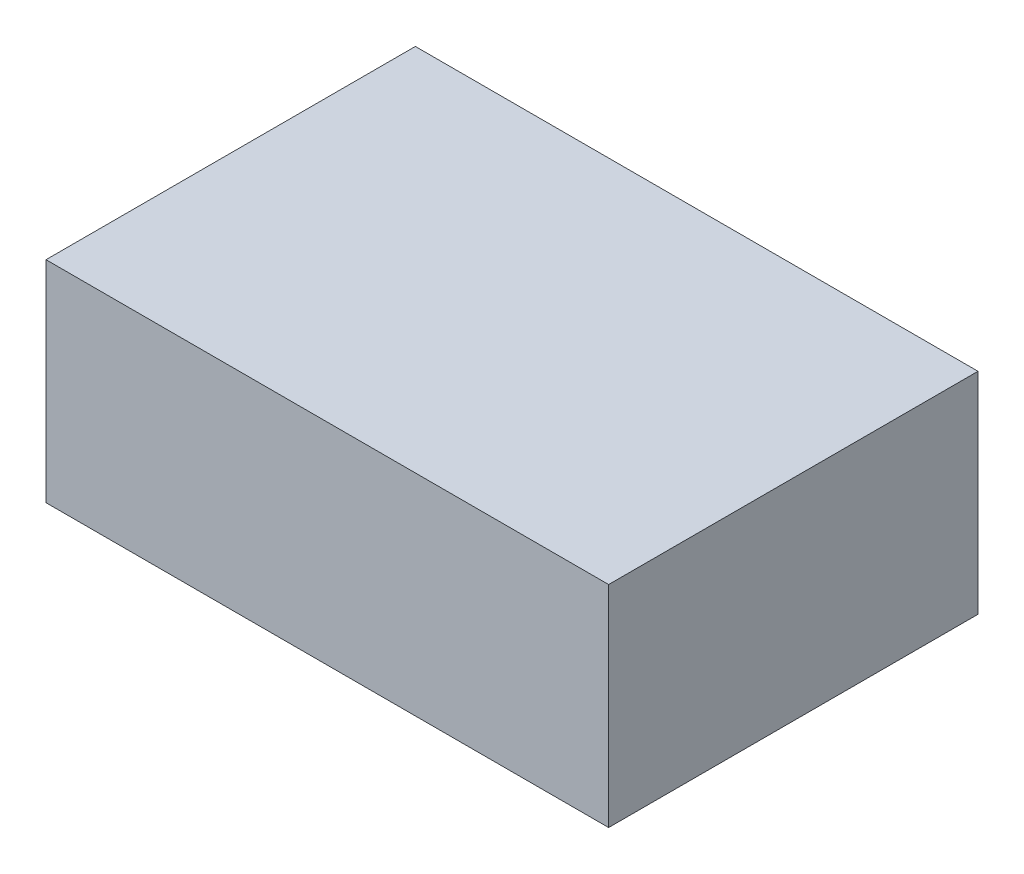
ISO-10303-21;
HEADER;
FILE_DESCRIPTION(('STEP AP214'),'2;1');
FILE_NAME('part.step','',(''),(''),'','','');
FILE_SCHEMA(('AUTOMOTIVE_DESIGN { 1 0 10303 214 1 1 1 1 }'));
ENDSEC;
DATA;
#1=APPLICATION_CONTEXT('core data for automotive mechanical design processes');
#2=APPLICATION_PROTOCOL_DEFINITION('international standard','automotive_design',2000,#1);
#3=PRODUCT_CONTEXT('',#1,'mechanical');
#4=PRODUCT('Part','Part','',(#3));
#5=PRODUCT_RELATED_PRODUCT_CATEGORY('part','',(#4));
#6=PRODUCT_DEFINITION_FORMATION('','',#4);
#7=PRODUCT_DEFINITION_CONTEXT('part definition',#1,'design');
#8=PRODUCT_DEFINITION('design','',#6,#7);
#9=PRODUCT_DEFINITION_SHAPE('','',#8);
#10=(LENGTH_UNIT() NAMED_UNIT(*) SI_UNIT(.MILLI.,.METRE.));
#11=(NAMED_UNIT(*) PLANE_ANGLE_UNIT() SI_UNIT($,.RADIAN.));
#12=(NAMED_UNIT(*) SI_UNIT($,.STERADIAN.) SOLID_ANGLE_UNIT());
#13=UNCERTAINTY_MEASURE_WITH_UNIT(LENGTH_MEASURE(1.E-05),#10,'distance_accuracy_value','');
#14=(GEOMETRIC_REPRESENTATION_CONTEXT(3) GLOBAL_UNCERTAINTY_ASSIGNED_CONTEXT((#13)) GLOBAL_UNIT_ASSIGNED_CONTEXT((#10,
#11,#12)) REPRESENTATION_CONTEXT('',''));
#15=CARTESIAN_POINT('',(0.,0.,0.));
#16=DIRECTION('',(0.,0.,1.));
#17=DIRECTION('',(1.,0.,0.));
#18=AXIS2_PLACEMENT_3D('',#15,#16,#17);
#19=CARTESIAN_POINT('',(0.,0.,0.));
#20=DIRECTION('',(0.,-1.,0.));
#21=DIRECTION('',(0.,0.,-1.));
#22=AXIS2_PLACEMENT_3D('',#19,#20,#21);
#23=PLANE('',#22);
#24=DIRECTION('',(0.,0.,-1.));
#25=VECTOR('',#24,1.);
#26=CARTESIAN_POINT('',(13.716,0.,9.0043));
#27=LINE('',#26,#25);
#28=CARTESIAN_POINT('',(13.716,0.,9.0043));
#29=VERTEX_POINT('',#28);
#30=CARTESIAN_POINT('',(13.716,0.,-9.0043));
#31=VERTEX_POINT('',#30);
#32=EDGE_CURVE('E176',#29,#31,#27,.T.);
#33=ORIENTED_EDGE('',*,*,#32,.F.);
#34=DIRECTION('',(1.,0.,0.));
#35=VECTOR('',#34,1.);
#36=CARTESIAN_POINT('',(-13.716,0.,9.0043));
#37=LINE('',#36,#35);
#38=CARTESIAN_POINT('',(-13.716,0.,9.0043));
#39=VERTEX_POINT('',#38);
#40=EDGE_CURVE('E78',#39,#29,#37,.T.);
#41=ORIENTED_EDGE('',*,*,#40,.F.);
#42=DIRECTION('',(0.,0.,1.));
#43=VECTOR('',#42,1.);
#44=CARTESIAN_POINT('',(-13.716,0.,9.0043));
#45=LINE('',#44,#43);
#46=CARTESIAN_POINT('',(-13.716,0.,-9.0043));
#47=VERTEX_POINT('',#46);
#48=EDGE_CURVE('E194',#47,#39,#45,.T.);
#49=ORIENTED_EDGE('',*,*,#48,.F.);
#50=DIRECTION('',(-1.,0.,0.));
#51=VECTOR('',#50,1.);
#52=CARTESIAN_POINT('',(-13.716,0.,-9.0043));
#53=LINE('',#52,#51);
#54=EDGE_CURVE('E180',#31,#47,#53,.T.);
#55=ORIENTED_EDGE('',*,*,#54,.F.);
#56=EDGE_LOOP('',(#33,#41,#49,#55));
#57=FACE_BOUND('',#56,.T.);
#58=DIRECTION('',(1.,0.,0.));
#59=VECTOR('',#58,1.);
#60=CARTESIAN_POINT('',(-0.5969,0.,1.9685));
#61=LINE('',#60,#59);
#62=CARTESIAN_POINT('',(-0.5969,0.,1.9685));
#63=VERTEX_POINT('',#62);
#64=CARTESIAN_POINT('',(0.5969,0.,1.9685));
#65=VERTEX_POINT('',#64);
#66=EDGE_CURVE('E171',#63,#65,#61,.T.);
#67=ORIENTED_EDGE('',*,*,#66,.T.);
#68=DIRECTION('',(0.,0.,-1.));
#69=VECTOR('',#68,1.);
#70=CARTESIAN_POINT('',(0.5969,0.,1.9685));
#71=LINE('',#70,#69);
#72=CARTESIAN_POINT('',(0.5969,0.,0.5969));
#73=VERTEX_POINT('',#72);
#74=EDGE_CURVE('E48',#65,#73,#71,.T.);
#75=ORIENTED_EDGE('',*,*,#74,.T.);
#76=DIRECTION('',(1.,0.,0.));
#77=VECTOR('',#76,1.);
#78=CARTESIAN_POINT('',(0.5969,0.,0.5969));
#79=LINE('',#78,#77);
#80=CARTESIAN_POINT('',(1.9685,0.,0.5969));
#81=VERTEX_POINT('',#80);
#82=EDGE_CURVE('E175',#73,#81,#79,.T.);
#83=ORIENTED_EDGE('',*,*,#82,.T.);
#84=DIRECTION('',(0.,0.,-1.));
#85=VECTOR('',#84,1.);
#86=CARTESIAN_POINT('',(1.9685,0.,0.5969));
#87=LINE('',#86,#85);
#88=CARTESIAN_POINT('',(1.9685,0.,-0.5969));
#89=VERTEX_POINT('',#88);
#90=EDGE_CURVE('E422',#81,#89,#87,.T.);
#91=ORIENTED_EDGE('',*,*,#90,.T.);
#92=DIRECTION('',(-1.,0.,0.));
#93=VECTOR('',#92,1.);
#94=CARTESIAN_POINT('',(1.9685,0.,-0.5969));
#95=LINE('',#94,#93);
#96=CARTESIAN_POINT('',(0.5969,0.,-0.5969));
#97=VERTEX_POINT('',#96);
#98=EDGE_CURVE('E424',#89,#97,#95,.T.);
#99=ORIENTED_EDGE('',*,*,#98,.T.);
#100=DIRECTION('',(0.,0.,-1.));
#101=VECTOR('',#100,1.);
#102=CARTESIAN_POINT('',(0.5969,0.,-0.5969));
#103=LINE('',#102,#101);
#104=CARTESIAN_POINT('',(0.5969,0.,-1.9685));
#105=VERTEX_POINT('',#104);
#106=EDGE_CURVE('E428',#97,#105,#103,.T.);
#107=ORIENTED_EDGE('',*,*,#106,.T.);
#108=DIRECTION('',(-1.,0.,0.));
#109=VECTOR('',#108,1.);
#110=CARTESIAN_POINT('',(0.5969,0.,-1.9685));
#111=LINE('',#110,#109);
#112=CARTESIAN_POINT('',(-0.596899999999997,0.,-1.9685));
#113=VERTEX_POINT('',#112);
#114=EDGE_CURVE('E435',#105,#113,#111,.T.);
#115=ORIENTED_EDGE('',*,*,#114,.T.);
#116=DIRECTION('',(0.,0.,1.));
#117=VECTOR('',#116,1.);
#118=CARTESIAN_POINT('',(-0.596899999999997,0.,-1.9685));
#119=LINE('',#118,#117);
#120=CARTESIAN_POINT('',(-0.5969,0.,-0.5969));
#121=VERTEX_POINT('',#120);
#122=EDGE_CURVE('E438',#113,#121,#119,.T.);
#123=ORIENTED_EDGE('',*,*,#122,.T.);
#124=DIRECTION('',(-1.,0.,0.));
#125=VECTOR('',#124,1.);
#126=CARTESIAN_POINT('',(-0.5969,0.,-0.5969));
#127=LINE('',#126,#125);
#128=CARTESIAN_POINT('',(-1.9685,0.,-0.5969));
#129=VERTEX_POINT('',#128);
#130=EDGE_CURVE('E441',#121,#129,#127,.T.);
#131=ORIENTED_EDGE('',*,*,#130,.T.);
#132=DIRECTION('',(0.,0.,1.));
#133=VECTOR('',#132,1.);
#134=CARTESIAN_POINT('',(-1.9685,0.,-0.5969));
#135=LINE('',#134,#133);
#136=CARTESIAN_POINT('',(-1.9685,0.,0.5969));
#137=VERTEX_POINT('',#136);
#138=EDGE_CURVE('E398',#129,#137,#135,.T.);
#139=ORIENTED_EDGE('',*,*,#138,.T.);
#140=DIRECTION('',(1.,0.,0.));
#141=VECTOR('',#140,1.);
#142=CARTESIAN_POINT('',(-1.9685,0.,0.5969));
#143=LINE('',#142,#141);
#144=CARTESIAN_POINT('',(-0.5969,0.,0.5969));
#145=VERTEX_POINT('',#144);
#146=EDGE_CURVE('E395',#137,#145,#143,.T.);
#147=ORIENTED_EDGE('',*,*,#146,.T.);
#148=DIRECTION('',(0.,0.,1.));
#149=VECTOR('',#148,1.);
#150=CARTESIAN_POINT('',(-0.5969,0.,0.5969));
#151=LINE('',#150,#149);
#152=EDGE_CURVE('E389',#145,#63,#151,.T.);
#153=ORIENTED_EDGE('',*,*,#152,.T.);
#154=EDGE_LOOP('',(#67,#75,#83,#91,#99,#107,#115,#123,#131,#139,#147,#153));
#155=FACE_BOUND('',#154,.T.);
#156=ADVANCED_FACE('F33',(#57,#155),#23,.T.);
#157=CARTESIAN_POINT('',(13.716,10.2616,9.0043));
#158=DIRECTION('',(-1.,0.,0.));
#159=DIRECTION('',(0.,0.,1.));
#160=AXIS2_PLACEMENT_3D('',#157,#158,#159);
#161=PLANE('',#160);
#162=ORIENTED_EDGE('',*,*,#32,.T.);
#163=DIRECTION('',(0.,-1.,0.));
#164=VECTOR('',#163,1.);
#165=CARTESIAN_POINT('',(13.716,10.2616,-9.0043));
#166=LINE('',#165,#164);
#167=CARTESIAN_POINT('',(13.716,10.2616,-9.0043));
#168=VERTEX_POINT('',#167);
#169=EDGE_CURVE('E11',#168,#31,#166,.T.);
#170=ORIENTED_EDGE('',*,*,#169,.F.);
#171=DIRECTION('',(0.,0.,-1.));
#172=VECTOR('',#171,1.);
#173=CARTESIAN_POINT('',(13.716,10.2616,9.0043));
#174=LINE('',#173,#172);
#175=CARTESIAN_POINT('',(13.716,10.2616,9.0043));
#176=VERTEX_POINT('',#175);
#177=EDGE_CURVE('E186',#176,#168,#174,.T.);
#178=ORIENTED_EDGE('',*,*,#177,.F.);
#179=DIRECTION('',(0.,-1.,0.));
#180=VECTOR('',#179,1.);
#181=CARTESIAN_POINT('',(13.716,10.2616,9.0043));
#182=LINE('',#181,#180);
#183=EDGE_CURVE('E191',#176,#29,#182,.T.);
#184=ORIENTED_EDGE('',*,*,#183,.T.);
#185=EDGE_LOOP('',(#162,#170,#178,#184));
#186=FACE_BOUND('',#185,.T.);
#187=ADVANCED_FACE('F35',(#186),#161,.F.);
#188=CARTESIAN_POINT('',(-13.716,10.2616,-9.0043));
#189=DIRECTION('',(0.,0.,1.));
#190=DIRECTION('',(1.,0.,0.));
#191=AXIS2_PLACEMENT_3D('',#188,#189,#190);
#192=PLANE('',#191);
#193=ORIENTED_EDGE('',*,*,#54,.T.);
#194=DIRECTION('',(0.,-1.,0.));
#195=VECTOR('',#194,1.);
#196=CARTESIAN_POINT('',(-13.716,10.2616,-9.0043));
#197=LINE('',#196,#195);
#198=CARTESIAN_POINT('',(-13.716,10.2616,-9.0043));
#199=VERTEX_POINT('',#198);
#200=EDGE_CURVE('E41',#199,#47,#197,.T.);
#201=ORIENTED_EDGE('',*,*,#200,.F.);
#202=DIRECTION('',(-1.,0.,0.));
#203=VECTOR('',#202,1.);
#204=CARTESIAN_POINT('',(-13.716,10.2616,-9.0043));
#205=LINE('',#204,#203);
#206=EDGE_CURVE('E85',#168,#199,#205,.T.);
#207=ORIENTED_EDGE('',*,*,#206,.F.);
#208=ORIENTED_EDGE('',*,*,#169,.T.);
#209=EDGE_LOOP('',(#193,#201,#207,#208));
#210=FACE_BOUND('',#209,.T.);
#211=ADVANCED_FACE('F220',(#210),#192,.F.);
#212=CARTESIAN_POINT('',(-13.716,10.2616,9.0043));
#213=DIRECTION('',(1.,0.,0.));
#214=DIRECTION('',(0.,0.,-1.));
#215=AXIS2_PLACEMENT_3D('',#212,#213,#214);
#216=PLANE('',#215);
#217=ORIENTED_EDGE('',*,*,#48,.T.);
#218=DIRECTION('',(0.,-1.,0.));
#219=VECTOR('',#218,1.);
#220=CARTESIAN_POINT('',(-13.716,10.2616,9.0043));
#221=LINE('',#220,#219);
#222=CARTESIAN_POINT('',(-13.716,10.2616,9.0043));
#223=VERTEX_POINT('',#222);
#224=EDGE_CURVE('E198',#223,#39,#221,.T.);
#225=ORIENTED_EDGE('',*,*,#224,.F.);
#226=DIRECTION('',(0.,0.,1.));
#227=VECTOR('',#226,1.);
#228=CARTESIAN_POINT('',(-13.716,10.2616,9.0043));
#229=LINE('',#228,#227);
#230=EDGE_CURVE('E189',#199,#223,#229,.T.);
#231=ORIENTED_EDGE('',*,*,#230,.F.);
#232=ORIENTED_EDGE('',*,*,#200,.T.);
#233=EDGE_LOOP('',(#217,#225,#231,#232));
#234=FACE_BOUND('',#233,.T.);
#235=ADVANCED_FACE('F203',(#234),#216,.F.);
#236=CARTESIAN_POINT('',(-13.716,10.2616,9.0043));
#237=DIRECTION('',(0.,0.,-1.));
#238=DIRECTION('',(-1.,0.,0.));
#239=AXIS2_PLACEMENT_3D('',#236,#237,#238);
#240=PLANE('',#239);
#241=ORIENTED_EDGE('',*,*,#40,.T.);
#242=ORIENTED_EDGE('',*,*,#183,.F.);
#243=DIRECTION('',(1.,0.,0.));
#244=VECTOR('',#243,1.);
#245=CARTESIAN_POINT('',(-13.716,10.2616,9.0043));
#246=LINE('',#245,#244);
#247=EDGE_CURVE('E57',#223,#176,#246,.T.);
#248=ORIENTED_EDGE('',*,*,#247,.F.);
#249=ORIENTED_EDGE('',*,*,#224,.T.);
#250=EDGE_LOOP('',(#241,#242,#248,#249));
#251=FACE_BOUND('',#250,.T.);
#252=ADVANCED_FACE('F211',(#251),#240,.F.);
#253=CARTESIAN_POINT('',(0.,10.2616,0.));
#254=DIRECTION('',(0.,-1.,0.));
#255=DIRECTION('',(0.,0.,-1.));
#256=AXIS2_PLACEMENT_3D('',#253,#254,#255);
#257=PLANE('',#256);
#258=ORIENTED_EDGE('',*,*,#177,.T.);
#259=ORIENTED_EDGE('',*,*,#206,.T.);
#260=ORIENTED_EDGE('',*,*,#230,.T.);
#261=ORIENTED_EDGE('',*,*,#247,.T.);
#262=EDGE_LOOP('',(#258,#259,#260,#261));
#263=FACE_BOUND('',#262,.T.);
#264=ADVANCED_FACE('F213',(#263),#257,.F.);
#265=CARTESIAN_POINT('',(0.5969,5.08,1.9685));
#266=DIRECTION('',(-1.,0.,0.));
#267=DIRECTION('',(0.,0.,1.));
#268=AXIS2_PLACEMENT_3D('',#265,#266,#267);
#269=PLANE('',#268);
#270=ORIENTED_EDGE('',*,*,#74,.F.);
#271=DIRECTION('',(0.,-1.,0.));
#272=VECTOR('',#271,1.);
#273=CARTESIAN_POINT('',(0.5969,5.08,1.9685));
#274=LINE('',#273,#272);
#275=CARTESIAN_POINT('',(0.5969,5.08,1.9685));
#276=VERTEX_POINT('',#275);
#277=EDGE_CURVE('E170',#276,#65,#274,.T.);
#278=ORIENTED_EDGE('',*,*,#277,.F.);
#279=DIRECTION('',(0.,0.,-1.));
#280=VECTOR('',#279,1.);
#281=CARTESIAN_POINT('',(0.5969,5.08,1.9685));
#282=LINE('',#281,#280);
#283=CARTESIAN_POINT('',(0.5969,5.08,0.5969));
#284=VERTEX_POINT('',#283);
#285=EDGE_CURVE('E161',#276,#284,#282,.T.);
#286=ORIENTED_EDGE('',*,*,#285,.T.);
#287=DIRECTION('',(0.,-1.,0.));
#288=VECTOR('',#287,1.);
#289=CARTESIAN_POINT('',(0.5969,5.08,0.5969));
#290=LINE('',#289,#288);
#291=EDGE_CURVE('E169',#284,#73,#290,.T.);
#292=ORIENTED_EDGE('',*,*,#291,.T.);
#293=EDGE_LOOP('',(#270,#278,#286,#292));
#294=FACE_BOUND('',#293,.T.);
#295=ADVANCED_FACE('F168',(#294),#269,.T.);
#296=CARTESIAN_POINT('',(0.5969,5.08,0.5969));
#297=DIRECTION('',(0.,0.,-1.));
#298=DIRECTION('',(-1.,0.,0.));
#299=AXIS2_PLACEMENT_3D('',#296,#297,#298);
#300=PLANE('',#299);
#301=ORIENTED_EDGE('',*,*,#82,.F.);
#302=ORIENTED_EDGE('',*,*,#291,.F.);
#303=DIRECTION('',(1.,0.,0.));
#304=VECTOR('',#303,1.);
#305=CARTESIAN_POINT('',(0.5969,5.08,0.5969));
#306=LINE('',#305,#304);
#307=CARTESIAN_POINT('',(1.9685,5.08,0.5969));
#308=VERTEX_POINT('',#307);
#309=EDGE_CURVE('E157',#284,#308,#306,.T.);
#310=ORIENTED_EDGE('',*,*,#309,.T.);
#311=DIRECTION('',(0.,-1.,0.));
#312=VECTOR('',#311,1.);
#313=CARTESIAN_POINT('',(1.9685,5.08,0.5969));
#314=LINE('',#313,#312);
#315=EDGE_CURVE('E177',#308,#81,#314,.T.);
#316=ORIENTED_EDGE('',*,*,#315,.T.);
#317=EDGE_LOOP('',(#301,#302,#310,#316));
#318=FACE_BOUND('',#317,.T.);
#319=ADVANCED_FACE('F173',(#318),#300,.T.);
#320=CARTESIAN_POINT('',(1.9685,5.08,0.5969));
#321=DIRECTION('',(-1.,0.,0.));
#322=DIRECTION('',(0.,0.,1.));
#323=AXIS2_PLACEMENT_3D('',#320,#321,#322);
#324=PLANE('',#323);
#325=ORIENTED_EDGE('',*,*,#90,.F.);
#326=ORIENTED_EDGE('',*,*,#315,.F.);
#327=DIRECTION('',(0.,0.,-1.));
#328=VECTOR('',#327,1.);
#329=CARTESIAN_POINT('',(1.9685,5.08,0.5969));
#330=LINE('',#329,#328);
#331=CARTESIAN_POINT('',(1.9685,5.08,-0.5969));
#332=VERTEX_POINT('',#331);
#333=EDGE_CURVE('E163',#308,#332,#330,.T.);
#334=ORIENTED_EDGE('',*,*,#333,.T.);
#335=DIRECTION('',(0.,-1.,0.));
#336=VECTOR('',#335,1.);
#337=CARTESIAN_POINT('',(1.9685,5.08,-0.5969));
#338=LINE('',#337,#336);
#339=EDGE_CURVE('E182',#332,#89,#338,.T.);
#340=ORIENTED_EDGE('',*,*,#339,.T.);
#341=EDGE_LOOP('',(#325,#326,#334,#340));
#342=FACE_BOUND('',#341,.T.);
#343=ADVANCED_FACE('F232',(#342),#324,.T.);
#344=CARTESIAN_POINT('',(1.9685,5.08,-0.5969));
#345=DIRECTION('',(0.,0.,1.));
#346=DIRECTION('',(1.,0.,0.));
#347=AXIS2_PLACEMENT_3D('',#344,#345,#346);
#348=PLANE('',#347);
#349=ORIENTED_EDGE('',*,*,#98,.F.);
#350=ORIENTED_EDGE('',*,*,#339,.F.);
#351=DIRECTION('',(-1.,0.,0.));
#352=VECTOR('',#351,1.);
#353=CARTESIAN_POINT('',(1.9685,5.08,-0.5969));
#354=LINE('',#353,#352);
#355=CARTESIAN_POINT('',(0.5969,5.08,-0.5969));
#356=VERTEX_POINT('',#355);
#357=EDGE_CURVE('E466',#332,#356,#354,.T.);
#358=ORIENTED_EDGE('',*,*,#357,.T.);
#359=DIRECTION('',(0.,-1.,0.));
#360=VECTOR('',#359,1.);
#361=CARTESIAN_POINT('',(0.5969,5.08,-0.5969));
#362=LINE('',#361,#360);
#363=EDGE_CURVE('E417',#356,#97,#362,.T.);
#364=ORIENTED_EDGE('',*,*,#363,.T.);
#365=EDGE_LOOP('',(#349,#350,#358,#364));
#366=FACE_BOUND('',#365,.T.);
#367=ADVANCED_FACE('F235',(#366),#348,.T.);
#368=CARTESIAN_POINT('',(0.5969,5.08,-0.5969));
#369=DIRECTION('',(-1.,0.,0.));
#370=DIRECTION('',(0.,0.,1.));
#371=AXIS2_PLACEMENT_3D('',#368,#369,#370);
#372=PLANE('',#371);
#373=ORIENTED_EDGE('',*,*,#106,.F.);
#374=ORIENTED_EDGE('',*,*,#363,.F.);
#375=DIRECTION('',(0.,0.,-1.));
#376=VECTOR('',#375,1.);
#377=CARTESIAN_POINT('',(0.5969,5.08,-0.5969));
#378=LINE('',#377,#376);
#379=CARTESIAN_POINT('',(0.5969,5.08,-1.9685));
#380=VERTEX_POINT('',#379);
#381=EDGE_CURVE('E464',#356,#380,#378,.T.);
#382=ORIENTED_EDGE('',*,*,#381,.T.);
#383=DIRECTION('',(0.,-1.,0.));
#384=VECTOR('',#383,1.);
#385=CARTESIAN_POINT('',(0.5969,5.08,-1.9685));
#386=LINE('',#385,#384);
#387=EDGE_CURVE('E415',#380,#105,#386,.T.);
#388=ORIENTED_EDGE('',*,*,#387,.T.);
#389=EDGE_LOOP('',(#373,#374,#382,#388));
#390=FACE_BOUND('',#389,.T.);
#391=ADVANCED_FACE('F239',(#390),#372,.T.);
#392=CARTESIAN_POINT('',(0.5969,5.08,-1.9685));
#393=DIRECTION('',(0.,0.,1.));
#394=DIRECTION('',(1.,0.,0.));
#395=AXIS2_PLACEMENT_3D('',#392,#393,#394);
#396=PLANE('',#395);
#397=ORIENTED_EDGE('',*,*,#114,.F.);
#398=ORIENTED_EDGE('',*,*,#387,.F.);
#399=DIRECTION('',(-1.,0.,0.));
#400=VECTOR('',#399,1.);
#401=CARTESIAN_POINT('',(0.5969,5.08,-1.9685));
#402=LINE('',#401,#400);
#403=CARTESIAN_POINT('',(-0.596899999999997,5.08,-1.9685));
#404=VERTEX_POINT('',#403);
#405=EDGE_CURVE('E462',#380,#404,#402,.T.);
#406=ORIENTED_EDGE('',*,*,#405,.T.);
#407=DIRECTION('',(0.,-1.,0.));
#408=VECTOR('',#407,1.);
#409=CARTESIAN_POINT('',(-0.596899999999997,5.08,-1.9685));
#410=LINE('',#409,#408);
#411=EDGE_CURVE('E413',#404,#113,#410,.T.);
#412=ORIENTED_EDGE('',*,*,#411,.T.);
#413=EDGE_LOOP('',(#397,#398,#406,#412));
#414=FACE_BOUND('',#413,.T.);
#415=ADVANCED_FACE('F243',(#414),#396,.T.);
#416=CARTESIAN_POINT('',(-0.596899999999997,5.08,-1.9685));
#417=DIRECTION('',(1.,0.,0.));
#418=DIRECTION('',(0.,0.,-1.));
#419=AXIS2_PLACEMENT_3D('',#416,#417,#418);
#420=PLANE('',#419);
#421=ORIENTED_EDGE('',*,*,#122,.F.);
#422=ORIENTED_EDGE('',*,*,#411,.F.);
#423=DIRECTION('',(0.,0.,1.));
#424=VECTOR('',#423,1.);
#425=CARTESIAN_POINT('',(-0.596899999999997,5.08,-1.9685));
#426=LINE('',#425,#424);
#427=CARTESIAN_POINT('',(-0.5969,5.08,-0.5969));
#428=VERTEX_POINT('',#427);
#429=EDGE_CURVE('E460',#404,#428,#426,.T.);
#430=ORIENTED_EDGE('',*,*,#429,.T.);
#431=DIRECTION('',(0.,-1.,0.));
#432=VECTOR('',#431,1.);
#433=CARTESIAN_POINT('',(-0.5969,5.08,-0.5969));
#434=LINE('',#433,#432);
#435=EDGE_CURVE('E411',#428,#121,#434,.T.);
#436=ORIENTED_EDGE('',*,*,#435,.T.);
#437=EDGE_LOOP('',(#421,#422,#430,#436));
#438=FACE_BOUND('',#437,.T.);
#439=ADVANCED_FACE('F247',(#438),#420,.T.);
#440=CARTESIAN_POINT('',(-0.5969,5.08,-0.5969));
#441=DIRECTION('',(0.,0.,1.));
#442=DIRECTION('',(1.,0.,0.));
#443=AXIS2_PLACEMENT_3D('',#440,#441,#442);
#444=PLANE('',#443);
#445=ORIENTED_EDGE('',*,*,#130,.F.);
#446=ORIENTED_EDGE('',*,*,#435,.F.);
#447=DIRECTION('',(-1.,0.,0.));
#448=VECTOR('',#447,1.);
#449=CARTESIAN_POINT('',(-0.5969,5.08,-0.5969));
#450=LINE('',#449,#448);
#451=CARTESIAN_POINT('',(-1.9685,5.08,-0.5969));
#452=VERTEX_POINT('',#451);
#453=EDGE_CURVE('E458',#428,#452,#450,.T.);
#454=ORIENTED_EDGE('',*,*,#453,.T.);
#455=DIRECTION('',(0.,-1.,0.));
#456=VECTOR('',#455,1.);
#457=CARTESIAN_POINT('',(-1.9685,5.08,-0.5969));
#458=LINE('',#457,#456);
#459=EDGE_CURVE('E409',#452,#129,#458,.T.);
#460=ORIENTED_EDGE('',*,*,#459,.T.);
#461=EDGE_LOOP('',(#445,#446,#454,#460));
#462=FACE_BOUND('',#461,.T.);
#463=ADVANCED_FACE('F251',(#462),#444,.T.);
#464=CARTESIAN_POINT('',(-1.9685,5.08,-0.5969));
#465=DIRECTION('',(1.,0.,0.));
#466=DIRECTION('',(0.,0.,-1.));
#467=AXIS2_PLACEMENT_3D('',#464,#465,#466);
#468=PLANE('',#467);
#469=ORIENTED_EDGE('',*,*,#138,.F.);
#470=ORIENTED_EDGE('',*,*,#459,.F.);
#471=DIRECTION('',(0.,0.,1.));
#472=VECTOR('',#471,1.);
#473=CARTESIAN_POINT('',(-1.9685,5.08,-0.5969));
#474=LINE('',#473,#472);
#475=CARTESIAN_POINT('',(-1.9685,5.08,0.5969));
#476=VERTEX_POINT('',#475);
#477=EDGE_CURVE('E448',#452,#476,#474,.T.);
#478=ORIENTED_EDGE('',*,*,#477,.T.);
#479=DIRECTION('',(0.,-1.,0.));
#480=VECTOR('',#479,1.);
#481=CARTESIAN_POINT('',(-1.9685,5.08,0.5969));
#482=LINE('',#481,#480);
#483=EDGE_CURVE('E407',#476,#137,#482,.T.);
#484=ORIENTED_EDGE('',*,*,#483,.T.);
#485=EDGE_LOOP('',(#469,#470,#478,#484));
#486=FACE_BOUND('',#485,.T.);
#487=ADVANCED_FACE('F255',(#486),#468,.T.);
#488=CARTESIAN_POINT('',(-1.9685,5.08,0.5969));
#489=DIRECTION('',(0.,0.,-1.));
#490=DIRECTION('',(-1.,0.,0.));
#491=AXIS2_PLACEMENT_3D('',#488,#489,#490);
#492=PLANE('',#491);
#493=ORIENTED_EDGE('',*,*,#146,.F.);
#494=ORIENTED_EDGE('',*,*,#483,.F.);
#495=DIRECTION('',(1.,0.,0.));
#496=VECTOR('',#495,1.);
#497=CARTESIAN_POINT('',(-1.9685,5.08,0.5969));
#498=LINE('',#497,#496);
#499=CARTESIAN_POINT('',(-0.5969,5.08,0.5969));
#500=VERTEX_POINT('',#499);
#501=EDGE_CURVE('E450',#476,#500,#498,.T.);
#502=ORIENTED_EDGE('',*,*,#501,.T.);
#503=DIRECTION('',(0.,-1.,0.));
#504=VECTOR('',#503,1.);
#505=CARTESIAN_POINT('',(-0.5969,5.08,0.5969));
#506=LINE('',#505,#504);
#507=EDGE_CURVE('E405',#500,#145,#506,.T.);
#508=ORIENTED_EDGE('',*,*,#507,.T.);
#509=EDGE_LOOP('',(#493,#494,#502,#508));
#510=FACE_BOUND('',#509,.T.);
#511=ADVANCED_FACE('F259',(#510),#492,.T.);
#512=CARTESIAN_POINT('',(-0.5969,5.08,0.5969));
#513=DIRECTION('',(1.,0.,0.));
#514=DIRECTION('',(0.,0.,-1.));
#515=AXIS2_PLACEMENT_3D('',#512,#513,#514);
#516=PLANE('',#515);
#517=ORIENTED_EDGE('',*,*,#152,.F.);
#518=ORIENTED_EDGE('',*,*,#507,.F.);
#519=DIRECTION('',(0.,0.,1.));
#520=VECTOR('',#519,1.);
#521=CARTESIAN_POINT('',(-0.5969,5.08,0.5969));
#522=LINE('',#521,#520);
#523=CARTESIAN_POINT('',(-0.5969,5.08,1.9685));
#524=VERTEX_POINT('',#523);
#525=EDGE_CURVE('E452',#500,#524,#522,.T.);
#526=ORIENTED_EDGE('',*,*,#525,.T.);
#527=DIRECTION('',(0.,-1.,0.));
#528=VECTOR('',#527,1.);
#529=CARTESIAN_POINT('',(-0.5969,5.08,1.9685));
#530=LINE('',#529,#528);
#531=EDGE_CURVE('E388',#524,#63,#530,.T.);
#532=ORIENTED_EDGE('',*,*,#531,.T.);
#533=EDGE_LOOP('',(#517,#518,#526,#532));
#534=FACE_BOUND('',#533,.T.);
#535=ADVANCED_FACE('F263',(#534),#516,.T.);
#536=CARTESIAN_POINT('',(-0.5969,5.08,1.9685));
#537=DIRECTION('',(0.,0.,-1.));
#538=DIRECTION('',(-1.,0.,0.));
#539=AXIS2_PLACEMENT_3D('',#536,#537,#538);
#540=PLANE('',#539);
#541=ORIENTED_EDGE('',*,*,#66,.F.);
#542=ORIENTED_EDGE('',*,*,#531,.F.);
#543=DIRECTION('',(1.,0.,0.));
#544=VECTOR('',#543,1.);
#545=CARTESIAN_POINT('',(-0.5969,5.08,1.9685));
#546=LINE('',#545,#544);
#547=EDGE_CURVE('E403',#524,#276,#546,.T.);
#548=ORIENTED_EDGE('',*,*,#547,.T.);
#549=ORIENTED_EDGE('',*,*,#277,.T.);
#550=EDGE_LOOP('',(#541,#542,#548,#549));
#551=FACE_BOUND('',#550,.T.);
#552=ADVANCED_FACE('F267',(#551),#540,.T.);
#553=CARTESIAN_POINT('',(0.,5.08,0.));
#554=DIRECTION('',(0.,-1.,0.));
#555=DIRECTION('',(0.,0.,-1.));
#556=AXIS2_PLACEMENT_3D('',#553,#554,#555);
#557=PLANE('',#556);
#558=ORIENTED_EDGE('',*,*,#285,.F.);
#559=ORIENTED_EDGE('',*,*,#547,.F.);
#560=ORIENTED_EDGE('',*,*,#525,.F.);
#561=ORIENTED_EDGE('',*,*,#501,.F.);
#562=ORIENTED_EDGE('',*,*,#477,.F.);
#563=ORIENTED_EDGE('',*,*,#453,.F.);
#564=ORIENTED_EDGE('',*,*,#429,.F.);
#565=ORIENTED_EDGE('',*,*,#405,.F.);
#566=ORIENTED_EDGE('',*,*,#381,.F.);
#567=ORIENTED_EDGE('',*,*,#357,.F.);
#568=ORIENTED_EDGE('',*,*,#333,.F.);
#569=ORIENTED_EDGE('',*,*,#309,.F.);
#570=EDGE_LOOP('',(#558,#559,#560,#561,#562,#563,#564,#565,#566,#567,#568,#569));
#571=FACE_BOUND('',#570,.T.);
#572=ADVANCED_FACE('F159',(#571),#557,.T.);
#573=CLOSED_SHELL('',(#156,#187,#211,#235,#252,#264,#295,#319,#343,#367,#391,#415,#439,#463,
#487,#511,#535,#552,#572));
#574=MANIFOLD_SOLID_BREP('B2',#573);
#575=ADVANCED_BREP_SHAPE_REPRESENTATION('',(#18,#574),#14);
#576=SHAPE_DEFINITION_REPRESENTATION(#9,#575);
ENDSEC;
END-ISO-10303-21;
